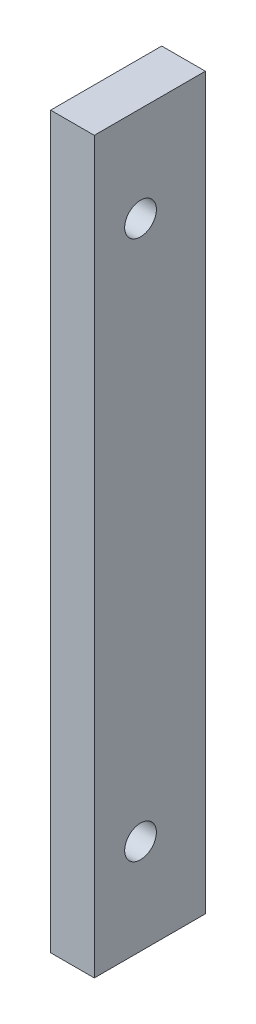
ISO-10303-21;
HEADER;
FILE_DESCRIPTION(('STEP AP214'),'2;1');
FILE_NAME('part.step','',(''),(''),'','','');
FILE_SCHEMA(('AUTOMOTIVE_DESIGN { 1 0 10303 214 1 1 1 1 }'));
ENDSEC;
DATA;
#1=APPLICATION_CONTEXT('core data for automotive mechanical design processes');
#2=APPLICATION_PROTOCOL_DEFINITION('international standard','automotive_design',2000,#1);
#3=PRODUCT_CONTEXT('',#1,'mechanical');
#4=PRODUCT('Part','Part','',(#3));
#5=PRODUCT_RELATED_PRODUCT_CATEGORY('part','',(#4));
#6=PRODUCT_DEFINITION_FORMATION('','',#4);
#7=PRODUCT_DEFINITION_CONTEXT('part definition',#1,'design');
#8=PRODUCT_DEFINITION('design','',#6,#7);
#9=PRODUCT_DEFINITION_SHAPE('','',#8);
#10=(LENGTH_UNIT() NAMED_UNIT(*) SI_UNIT(.MILLI.,.METRE.));
#11=(NAMED_UNIT(*) PLANE_ANGLE_UNIT() SI_UNIT($,.RADIAN.));
#12=(NAMED_UNIT(*) SI_UNIT($,.STERADIAN.) SOLID_ANGLE_UNIT());
#13=UNCERTAINTY_MEASURE_WITH_UNIT(LENGTH_MEASURE(1.E-05),#10,'distance_accuracy_value','');
#14=(GEOMETRIC_REPRESENTATION_CONTEXT(3) GLOBAL_UNCERTAINTY_ASSIGNED_CONTEXT((#13)) GLOBAL_UNIT_ASSIGNED_CONTEXT((#10,
#11,#12)) REPRESENTATION_CONTEXT('',''));
#15=CARTESIAN_POINT('',(0.,0.,0.));
#16=DIRECTION('',(0.,0.,1.));
#17=DIRECTION('',(1.,0.,0.));
#18=AXIS2_PLACEMENT_3D('',#15,#16,#17);
#19=CARTESIAN_POINT('',(0.,584.2,0.));
#20=DIRECTION('',(0.,0.,-1.));
#21=DIRECTION('',(-1.,0.,0.));
#22=AXIS2_PLACEMENT_3D('',#19,#20,#21);
#23=PLANE('',#22);
#24=DIRECTION('',(0.,-1.,0.));
#25=VECTOR('',#24,1.);
#26=CARTESIAN_POINT('',(34.925,0.,0.));
#27=LINE('',#26,#25);
#28=CARTESIAN_POINT('',(34.925,584.2,0.));
#29=VERTEX_POINT('',#28);
#30=CARTESIAN_POINT('',(34.925,0.,0.));
#31=VERTEX_POINT('',#30);
#32=EDGE_CURVE('E48',#29,#31,#27,.T.);
#33=ORIENTED_EDGE('',*,*,#32,.F.);
#34=DIRECTION('',(1.,0.,0.));
#35=VECTOR('',#34,1.);
#36=CARTESIAN_POINT('',(0.,584.2,0.));
#37=LINE('',#36,#35);
#38=CARTESIAN_POINT('',(0.,584.2,0.));
#39=VERTEX_POINT('',#38);
#40=EDGE_CURVE('E97',#39,#29,#37,.T.);
#41=ORIENTED_EDGE('',*,*,#40,.F.);
#42=DIRECTION('',(0.,-1.,0.));
#43=VECTOR('',#42,1.);
#44=CARTESIAN_POINT('',(0.,584.2,0.));
#45=LINE('',#44,#43);
#46=CARTESIAN_POINT('',(0.,0.,0.));
#47=VERTEX_POINT('',#46);
#48=EDGE_CURVE('E11',#39,#47,#45,.T.);
#49=ORIENTED_EDGE('',*,*,#48,.T.);
#50=DIRECTION('',(1.,0.,0.));
#51=VECTOR('',#50,1.);
#52=CARTESIAN_POINT('',(0.,0.,0.));
#53=LINE('',#52,#51);
#54=EDGE_CURVE('E81',#47,#31,#53,.T.);
#55=ORIENTED_EDGE('',*,*,#54,.T.);
#56=EDGE_LOOP('',(#33,#41,#49,#55));
#57=FACE_BOUND('',#56,.T.);
#58=ADVANCED_FACE('F33',(#57),#23,.F.);
#59=CARTESIAN_POINT('',(0.,584.2,-88.9));
#60=DIRECTION('',(0.,0.,1.));
#61=DIRECTION('',(1.,0.,0.));
#62=AXIS2_PLACEMENT_3D('',#59,#60,#61);
#63=PLANE('',#62);
#64=DIRECTION('',(0.,1.,0.));
#65=VECTOR('',#64,1.);
#66=CARTESIAN_POINT('',(34.925,0.,-88.9));
#67=LINE('',#66,#65);
#68=CARTESIAN_POINT('',(34.925,0.,-88.9));
#69=VERTEX_POINT('',#68);
#70=CARTESIAN_POINT('',(34.925,584.2,-88.9));
#71=VERTEX_POINT('',#70);
#72=EDGE_CURVE('E77',#69,#71,#67,.T.);
#73=ORIENTED_EDGE('',*,*,#72,.F.);
#74=DIRECTION('',(-1.,0.,0.));
#75=VECTOR('',#74,1.);
#76=CARTESIAN_POINT('',(0.,0.,-88.9));
#77=LINE('',#76,#75);
#78=CARTESIAN_POINT('',(0.,0.,-88.9));
#79=VERTEX_POINT('',#78);
#80=EDGE_CURVE('E71',#69,#79,#77,.T.);
#81=ORIENTED_EDGE('',*,*,#80,.T.);
#82=DIRECTION('',(0.,-1.,0.));
#83=VECTOR('',#82,1.);
#84=CARTESIAN_POINT('',(0.,584.2,-88.9));
#85=LINE('',#84,#83);
#86=CARTESIAN_POINT('',(0.,584.2,-88.9));
#87=VERTEX_POINT('',#86);
#88=EDGE_CURVE('E41',#87,#79,#85,.T.);
#89=ORIENTED_EDGE('',*,*,#88,.F.);
#90=DIRECTION('',(-1.,0.,0.));
#91=VECTOR('',#90,1.);
#92=CARTESIAN_POINT('',(0.,584.2,-88.9));
#93=LINE('',#92,#91);
#94=EDGE_CURVE('E57',#71,#87,#93,.T.);
#95=ORIENTED_EDGE('',*,*,#94,.F.);
#96=EDGE_LOOP('',(#73,#81,#89,#95));
#97=FACE_BOUND('',#96,.T.);
#98=ADVANCED_FACE('F73',(#97),#63,.F.);
#99=CARTESIAN_POINT('',(0.,584.2,0.));
#100=DIRECTION('',(0.,-1.,0.));
#101=DIRECTION('',(0.,0.,-1.));
#102=AXIS2_PLACEMENT_3D('',#99,#100,#101);
#103=PLANE('',#102);
#104=DIRECTION('',(0.,0.,1.));
#105=VECTOR('',#104,1.);
#106=CARTESIAN_POINT('',(34.925,584.2,0.));
#107=LINE('',#106,#105);
#108=EDGE_CURVE('E107',#71,#29,#107,.T.);
#109=ORIENTED_EDGE('',*,*,#108,.F.);
#110=ORIENTED_EDGE('',*,*,#94,.T.);
#111=DIRECTION('',(0.,0.,1.));
#112=VECTOR('',#111,1.);
#113=CARTESIAN_POINT('',(0.,584.2,0.));
#114=LINE('',#113,#112);
#115=EDGE_CURVE('E80',#87,#39,#114,.T.);
#116=ORIENTED_EDGE('',*,*,#115,.T.);
#117=ORIENTED_EDGE('',*,*,#40,.T.);
#118=EDGE_LOOP('',(#109,#110,#116,#117));
#119=FACE_BOUND('',#118,.T.);
#120=ADVANCED_FACE('F135',(#119),#103,.F.);
#121=CARTESIAN_POINT('',(0.,0.,0.));
#122=DIRECTION('',(0.,-1.,0.));
#123=DIRECTION('',(0.,0.,-1.));
#124=AXIS2_PLACEMENT_3D('',#121,#122,#123);
#125=PLANE('',#124);
#126=ORIENTED_EDGE('',*,*,#80,.F.);
#127=DIRECTION('',(0.,0.,-1.));
#128=VECTOR('',#127,1.);
#129=CARTESIAN_POINT('',(34.925,0.,0.));
#130=LINE('',#129,#128);
#131=EDGE_CURVE('E110',#31,#69,#130,.T.);
#132=ORIENTED_EDGE('',*,*,#131,.F.);
#133=ORIENTED_EDGE('',*,*,#54,.F.);
#134=DIRECTION('',(0.,0.,1.));
#135=VECTOR('',#134,1.);
#136=CARTESIAN_POINT('',(0.,0.,0.));
#137=LINE('',#136,#135);
#138=EDGE_CURVE('E86',#79,#47,#137,.T.);
#139=ORIENTED_EDGE('',*,*,#138,.F.);
#140=EDGE_LOOP('',(#126,#132,#133,#139));
#141=FACE_BOUND('',#140,.T.);
#142=ADVANCED_FACE('F87',(#141),#125,.T.);
#143=CARTESIAN_POINT('',(0.,76.2,-37.0103400000001));
#144=DIRECTION('',(1.,0.,0.));
#145=DIRECTION('',(0.,0.,-1.));
#146=AXIS2_PLACEMENT_3D('',#143,#144,#145);
#147=CYLINDRICAL_SURFACE('',#146,12.7);
#148=CARTESIAN_POINT('',(0.,76.2,-37.0103400000001));
#149=DIRECTION('',(1.,0.,0.));
#150=DIRECTION('',(0.,0.,-1.));
#151=AXIS2_PLACEMENT_3D('',#148,#149,#150);
#152=CIRCLE('',#151,12.7);
#153=CARTESIAN_POINT('',(0.,76.2,-49.7103400000001));
#154=VERTEX_POINT('',#153);
#155=EDGE_CURVE('E93',#154,#154,#152,.T.);
#156=CARTESIAN_POINT('',(34.925,76.2,-37.0103400000001));
#157=DIRECTION('',(1.,0.,0.));
#158=DIRECTION('',(0.,0.,-1.));
#159=AXIS2_PLACEMENT_3D('',#156,#157,#158);
#160=CIRCLE('',#159,12.7);
#161=CARTESIAN_POINT('',(34.925,76.2,-49.7103400000001));
#162=VERTEX_POINT('',#161);
#163=EDGE_CURVE('E102',#162,#162,#160,.F.);
#164=CARTESIAN_POINT('',(0.,76.2,-49.7103400000001));
#165=CARTESIAN_POINT('',(0.363802083333333,76.2,-49.7103400000001));
#166=CARTESIAN_POINT('',(0.727604166666667,76.2,-49.7103400000001));
#167=CARTESIAN_POINT('',(1.45520833333333,76.2,-49.7103400000001));
#168=CARTESIAN_POINT('',(1.81901041666667,76.2,-49.7103400000001));
#169=CARTESIAN_POINT('',(2.54661458333333,76.2,-49.7103400000001));
#170=CARTESIAN_POINT('',(2.91041666666667,76.2,-49.7103400000001));
#171=CARTESIAN_POINT('',(3.63802083333333,76.2,-49.7103400000001));
#172=CARTESIAN_POINT('',(4.00182291666667,76.2,-49.7103400000001));
#173=CARTESIAN_POINT('',(4.72942708333333,76.2,-49.7103400000001));
#174=CARTESIAN_POINT('',(5.09322916666667,76.2,-49.7103400000001));
#175=CARTESIAN_POINT('',(5.82083333333333,76.2,-49.7103400000001));
#176=CARTESIAN_POINT('',(6.18463541666667,76.2,-49.7103400000001));
#177=CARTESIAN_POINT('',(6.91223958333333,76.2,-49.7103400000001));
#178=CARTESIAN_POINT('',(7.27604166666667,76.2,-49.7103400000001));
#179=CARTESIAN_POINT('',(8.00364583333334,76.2,-49.7103400000001));
#180=CARTESIAN_POINT('',(8.36744791666667,76.2,-49.7103400000001));
#181=CARTESIAN_POINT('',(9.09505208333333,76.2,-49.7103400000001));
#182=CARTESIAN_POINT('',(9.45885416666667,76.2,-49.7103400000001));
#183=CARTESIAN_POINT('',(10.1864583333333,76.2,-49.7103400000001));
#184=CARTESIAN_POINT('',(10.5502604166667,76.2,-49.7103400000001));
#185=CARTESIAN_POINT('',(11.2778645833333,76.2,-49.7103400000001));
#186=CARTESIAN_POINT('',(11.6416666666667,76.2,-49.7103400000001));
#187=CARTESIAN_POINT('',(12.3692708333333,76.2,-49.7103400000001));
#188=CARTESIAN_POINT('',(12.7330729166667,76.2,-49.7103400000001));
#189=CARTESIAN_POINT('',(13.4606770833333,76.2,-49.7103400000001));
#190=CARTESIAN_POINT('',(13.8244791666667,76.2,-49.7103400000001));
#191=CARTESIAN_POINT('',(14.5520833333333,76.2,-49.7103400000001));
#192=CARTESIAN_POINT('',(14.9158854166667,76.2,-49.7103400000001));
#193=CARTESIAN_POINT('',(15.6434895833333,76.2,-49.7103400000001));
#194=CARTESIAN_POINT('',(16.0072916666667,76.2,-49.7103400000001));
#195=CARTESIAN_POINT('',(16.7348958333333,76.2,-49.7103400000001));
#196=CARTESIAN_POINT('',(17.0986979166667,76.2,-49.7103400000001));
#197=CARTESIAN_POINT('',(17.8263020833333,76.2,-49.7103400000001));
#198=CARTESIAN_POINT('',(18.1901041666667,76.2,-49.7103400000001));
#199=CARTESIAN_POINT('',(18.9177083333333,76.2,-49.7103400000001));
#200=CARTESIAN_POINT('',(19.2815104166667,76.2,-49.7103400000001));
#201=CARTESIAN_POINT('',(20.0091145833333,76.2,-49.7103400000001));
#202=CARTESIAN_POINT('',(20.3729166666667,76.2,-49.7103400000001));
#203=CARTESIAN_POINT('',(21.1005208333333,76.2,-49.7103400000001));
#204=CARTESIAN_POINT('',(21.4643229166667,76.2,-49.7103400000001));
#205=CARTESIAN_POINT('',(22.1919270833333,76.2,-49.7103400000001));
#206=CARTESIAN_POINT('',(22.5557291666667,76.2,-49.7103400000001));
#207=CARTESIAN_POINT('',(23.2833333333333,76.2,-49.7103400000001));
#208=CARTESIAN_POINT('',(23.6471354166667,76.2,-49.7103400000001));
#209=CARTESIAN_POINT('',(24.3747395833333,76.2,-49.7103400000001));
#210=CARTESIAN_POINT('',(24.7385416666667,76.2,-49.7103400000001));
#211=CARTESIAN_POINT('',(25.4661458333333,76.2,-49.7103400000001));
#212=CARTESIAN_POINT('',(25.8299479166667,76.2,-49.7103400000001));
#213=CARTESIAN_POINT('',(26.5575520833333,76.2,-49.7103400000001));
#214=CARTESIAN_POINT('',(26.9213541666667,76.2,-49.7103400000001));
#215=CARTESIAN_POINT('',(27.6489583333333,76.2,-49.7103400000001));
#216=CARTESIAN_POINT('',(28.0127604166667,76.2,-49.7103400000001));
#217=CARTESIAN_POINT('',(28.7403645833333,76.2,-49.7103400000001));
#218=CARTESIAN_POINT('',(29.1041666666667,76.2,-49.7103400000001));
#219=CARTESIAN_POINT('',(29.8317708333333,76.2,-49.7103400000001));
#220=CARTESIAN_POINT('',(30.1955729166667,76.2,-49.7103400000001));
#221=CARTESIAN_POINT('',(30.9231770833333,76.2,-49.7103400000001));
#222=CARTESIAN_POINT('',(31.2869791666667,76.2,-49.7103400000001));
#223=CARTESIAN_POINT('',(32.0145833333333,76.2,-49.7103400000001));
#224=CARTESIAN_POINT('',(32.3783854166667,76.2,-49.7103400000001));
#225=CARTESIAN_POINT('',(33.1059895833333,76.2,-49.7103400000001));
#226=CARTESIAN_POINT('',(33.4697916666667,76.2,-49.7103400000001));
#227=CARTESIAN_POINT('',(34.1973958333333,76.2,-49.7103400000001));
#228=CARTESIAN_POINT('',(34.5611979166667,76.2,-49.7103400000001));
#229=CARTESIAN_POINT('',(34.925,76.2,-49.7103400000001));
#230=B_SPLINE_CURVE_WITH_KNOTS('',3,(#164,#165,#166,#167,#168,#169,#170,#171,#172,#173,#174,
#175,#176,#177,#178,#179,#180,#181,#182,#183,#184,#185,#186,#187,#188,#189,#190,#191,#192,#193,
#194,#195,#196,#197,#198,#199,#200,#201,#202,#203,#204,#205,#206,#207,#208,#209,#210,#211,#212,
#213,#214,#215,#216,#217,#218,#219,#220,#221,#222,#223,#224,#225,#226,#227,#228,#229),
.UNSPECIFIED.,.F.,.F.,(4,2,2,2,2,2,2,2,2,2,2,2,2,2,2,2,2,2,2,2,2,2,2,2,2,2,2,2,2,2,2,2,4),(0.,
1.09140625,2.1828125,3.27421875,4.365625,5.45703125,6.5484375,7.63984375,8.73125,9.82265625,
10.9140625,12.00546875,13.096875,14.18828125,15.2796875,16.37109375,17.4625,18.55390625,
19.6453125,20.73671875,21.828125,22.91953125,24.0109375,25.10234375,26.19375,27.28515625,
28.3765625,29.46796875,30.559375,31.65078125,32.7421875,33.83359375,34.925),.UNSPECIFIED.);
#231=EDGE_CURVE('BSEAM124',#154,#162,#230,.T.);
#232=ORIENTED_EDGE('',*,*,#155,.F.);
#233=ORIENTED_EDGE('',*,*,#163,.F.);
#234=ORIENTED_EDGE('',*,*,#231,.T.);
#235=ORIENTED_EDGE('',*,*,#231,.F.);
#236=EDGE_LOOP('',(#232,#234,#233,#235));
#237=FACE_BOUND('',#236,.T.);
#238=ADVANCED_FACE('F124',(#237),#147,.F.);
#239=CARTESIAN_POINT('',(0.,508.,-37.01034));
#240=DIRECTION('',(1.,0.,0.));
#241=DIRECTION('',(0.,0.,-1.));
#242=AXIS2_PLACEMENT_3D('',#239,#240,#241);
#243=CYLINDRICAL_SURFACE('',#242,12.7);
#244=CARTESIAN_POINT('',(0.,508.,-37.01034));
#245=DIRECTION('',(1.,0.,0.));
#246=DIRECTION('',(0.,0.,-1.));
#247=AXIS2_PLACEMENT_3D('',#244,#245,#246);
#248=CIRCLE('',#247,12.7);
#249=CARTESIAN_POINT('',(0.,508.,-49.71034));
#250=VERTEX_POINT('',#249);
#251=EDGE_CURVE('E89',#250,#250,#248,.T.);
#252=CARTESIAN_POINT('',(34.925,508.,-37.01034));
#253=DIRECTION('',(1.,0.,0.));
#254=DIRECTION('',(0.,0.,-1.));
#255=AXIS2_PLACEMENT_3D('',#252,#253,#254);
#256=CIRCLE('',#255,12.7);
#257=CARTESIAN_POINT('',(34.925,508.,-49.71034));
#258=VERTEX_POINT('',#257);
#259=EDGE_CURVE('E112',#258,#258,#256,.T.);
#260=CARTESIAN_POINT('',(0.,508.,-49.71034));
#261=CARTESIAN_POINT('',(0.363802083333333,508.,-49.71034));
#262=CARTESIAN_POINT('',(0.727604166666667,508.,-49.71034));
#263=CARTESIAN_POINT('',(1.45520833333333,508.,-49.71034));
#264=CARTESIAN_POINT('',(1.81901041666667,508.,-49.71034));
#265=CARTESIAN_POINT('',(2.54661458333333,508.,-49.71034));
#266=CARTESIAN_POINT('',(2.91041666666667,508.,-49.71034));
#267=CARTESIAN_POINT('',(3.63802083333333,508.,-49.71034));
#268=CARTESIAN_POINT('',(4.00182291666667,508.,-49.71034));
#269=CARTESIAN_POINT('',(4.72942708333333,508.,-49.71034));
#270=CARTESIAN_POINT('',(5.09322916666667,508.,-49.71034));
#271=CARTESIAN_POINT('',(5.82083333333333,508.,-49.71034));
#272=CARTESIAN_POINT('',(6.18463541666667,508.,-49.71034));
#273=CARTESIAN_POINT('',(6.91223958333333,508.,-49.71034));
#274=CARTESIAN_POINT('',(7.27604166666667,508.,-49.71034));
#275=CARTESIAN_POINT('',(8.00364583333334,508.,-49.71034));
#276=CARTESIAN_POINT('',(8.36744791666667,508.,-49.71034));
#277=CARTESIAN_POINT('',(9.09505208333333,508.,-49.71034));
#278=CARTESIAN_POINT('',(9.45885416666667,508.,-49.71034));
#279=CARTESIAN_POINT('',(10.1864583333333,508.,-49.71034));
#280=CARTESIAN_POINT('',(10.5502604166667,508.,-49.71034));
#281=CARTESIAN_POINT('',(11.2778645833333,508.,-49.71034));
#282=CARTESIAN_POINT('',(11.6416666666667,508.,-49.71034));
#283=CARTESIAN_POINT('',(12.3692708333333,508.,-49.71034));
#284=CARTESIAN_POINT('',(12.7330729166667,508.,-49.71034));
#285=CARTESIAN_POINT('',(13.4606770833333,508.,-49.71034));
#286=CARTESIAN_POINT('',(13.8244791666667,508.,-49.71034));
#287=CARTESIAN_POINT('',(14.5520833333333,508.,-49.71034));
#288=CARTESIAN_POINT('',(14.9158854166667,508.,-49.71034));
#289=CARTESIAN_POINT('',(15.6434895833333,508.,-49.71034));
#290=CARTESIAN_POINT('',(16.0072916666667,508.,-49.71034));
#291=CARTESIAN_POINT('',(16.7348958333333,508.,-49.71034));
#292=CARTESIAN_POINT('',(17.0986979166667,508.,-49.71034));
#293=CARTESIAN_POINT('',(17.8263020833333,508.,-49.71034));
#294=CARTESIAN_POINT('',(18.1901041666667,508.,-49.71034));
#295=CARTESIAN_POINT('',(18.9177083333333,508.,-49.71034));
#296=CARTESIAN_POINT('',(19.2815104166667,508.,-49.71034));
#297=CARTESIAN_POINT('',(20.0091145833333,508.,-49.71034));
#298=CARTESIAN_POINT('',(20.3729166666667,508.,-49.71034));
#299=CARTESIAN_POINT('',(21.1005208333333,508.,-49.71034));
#300=CARTESIAN_POINT('',(21.4643229166667,508.,-49.71034));
#301=CARTESIAN_POINT('',(22.1919270833333,508.,-49.71034));
#302=CARTESIAN_POINT('',(22.5557291666667,508.,-49.71034));
#303=CARTESIAN_POINT('',(23.2833333333333,508.,-49.71034));
#304=CARTESIAN_POINT('',(23.6471354166667,508.,-49.71034));
#305=CARTESIAN_POINT('',(24.3747395833333,508.,-49.71034));
#306=CARTESIAN_POINT('',(24.7385416666667,508.,-49.71034));
#307=CARTESIAN_POINT('',(25.4661458333333,508.,-49.71034));
#308=CARTESIAN_POINT('',(25.8299479166667,508.,-49.71034));
#309=CARTESIAN_POINT('',(26.5575520833333,508.,-49.71034));
#310=CARTESIAN_POINT('',(26.9213541666667,508.,-49.71034));
#311=CARTESIAN_POINT('',(27.6489583333333,508.,-49.71034));
#312=CARTESIAN_POINT('',(28.0127604166667,508.,-49.71034));
#313=CARTESIAN_POINT('',(28.7403645833333,508.,-49.71034));
#314=CARTESIAN_POINT('',(29.1041666666667,508.,-49.71034));
#315=CARTESIAN_POINT('',(29.8317708333333,508.,-49.71034));
#316=CARTESIAN_POINT('',(30.1955729166667,508.,-49.71034));
#317=CARTESIAN_POINT('',(30.9231770833333,508.,-49.71034));
#318=CARTESIAN_POINT('',(31.2869791666667,508.,-49.71034));
#319=CARTESIAN_POINT('',(32.0145833333333,508.,-49.71034));
#320=CARTESIAN_POINT('',(32.3783854166667,508.,-49.71034));
#321=CARTESIAN_POINT('',(33.1059895833333,508.,-49.71034));
#322=CARTESIAN_POINT('',(33.4697916666667,508.,-49.71034));
#323=CARTESIAN_POINT('',(34.1973958333333,508.,-49.71034));
#324=CARTESIAN_POINT('',(34.5611979166667,508.,-49.71034));
#325=CARTESIAN_POINT('',(34.925,508.,-49.71034));
#326=B_SPLINE_CURVE_WITH_KNOTS('',3,(#260,#261,#262,#263,#264,#265,#266,#267,#268,#269,#270,
#271,#272,#273,#274,#275,#276,#277,#278,#279,#280,#281,#282,#283,#284,#285,#286,#287,#288,#289,
#290,#291,#292,#293,#294,#295,#296,#297,#298,#299,#300,#301,#302,#303,#304,#305,#306,#307,#308,
#309,#310,#311,#312,#313,#314,#315,#316,#317,#318,#319,#320,#321,#322,#323,#324,#325),
.UNSPECIFIED.,.F.,.F.,(4,2,2,2,2,2,2,2,2,2,2,2,2,2,2,2,2,2,2,2,2,2,2,2,2,2,2,2,2,2,2,2,4),(0.,
1.09140625,2.1828125,3.27421875,4.365625,5.45703125,6.5484375,7.63984375,8.73125,9.82265625,
10.9140625,12.00546875,13.096875,14.18828125,15.2796875,16.37109375,17.4625,18.55390625,
19.6453125,20.73671875,21.828125,22.91953125,24.0109375,25.10234375,26.19375,27.28515625,
28.3765625,29.46796875,30.559375,31.65078125,32.7421875,33.83359375,34.925),.UNSPECIFIED.);
#327=EDGE_CURVE('BSEAM116',#250,#258,#326,.T.);
#328=ORIENTED_EDGE('',*,*,#251,.F.);
#329=ORIENTED_EDGE('',*,*,#259,.T.);
#330=ORIENTED_EDGE('',*,*,#327,.T.);
#331=ORIENTED_EDGE('',*,*,#327,.F.);
#332=EDGE_LOOP('',(#328,#330,#329,#331));
#333=FACE_BOUND('',#332,.T.);
#334=ADVANCED_FACE('F116',(#333),#243,.F.);
#335=CARTESIAN_POINT('',(0.,584.2,0.));
#336=DIRECTION('',(1.,0.,0.));
#337=DIRECTION('',(0.,0.,-1.));
#338=AXIS2_PLACEMENT_3D('',#335,#336,#337);
#339=PLANE('',#338);
#340=ORIENTED_EDGE('',*,*,#251,.T.);
#341=EDGE_LOOP('',(#340));
#342=FACE_BOUND('',#341,.T.);
#343=ORIENTED_EDGE('',*,*,#155,.T.);
#344=EDGE_LOOP('',(#343));
#345=FACE_BOUND('',#344,.T.);
#346=ORIENTED_EDGE('',*,*,#138,.T.);
#347=ORIENTED_EDGE('',*,*,#48,.F.);
#348=ORIENTED_EDGE('',*,*,#115,.F.);
#349=ORIENTED_EDGE('',*,*,#88,.T.);
#350=EDGE_LOOP('',(#346,#347,#348,#349));
#351=FACE_BOUND('',#350,.T.);
#352=ADVANCED_FACE('F35',(#342,#345,#351),#339,.F.);
#353=CARTESIAN_POINT('',(34.925,0.,0.));
#354=DIRECTION('',(1.,0.,0.));
#355=DIRECTION('',(0.,0.,-1.));
#356=AXIS2_PLACEMENT_3D('',#353,#354,#355);
#357=PLANE('',#356);
#358=ORIENTED_EDGE('',*,*,#259,.F.);
#359=EDGE_LOOP('',(#358));
#360=FACE_BOUND('',#359,.T.);
#361=ORIENTED_EDGE('',*,*,#131,.T.);
#362=ORIENTED_EDGE('',*,*,#72,.T.);
#363=ORIENTED_EDGE('',*,*,#108,.T.);
#364=ORIENTED_EDGE('',*,*,#32,.T.);
#365=EDGE_LOOP('',(#361,#362,#363,#364));
#366=FACE_BOUND('',#365,.T.);
#367=ORIENTED_EDGE('',*,*,#163,.T.);
#368=EDGE_LOOP('',(#367));
#369=FACE_BOUND('',#368,.T.);
#370=ADVANCED_FACE('F118',(#360,#366,#369),#357,.T.);
#371=CLOSED_SHELL('',(#58,#98,#120,#142,#238,#334,#352,#370));
#372=MANIFOLD_SOLID_BREP('B2',#371);
#373=ADVANCED_BREP_SHAPE_REPRESENTATION('',(#18,#372),#14);
#374=SHAPE_DEFINITION_REPRESENTATION(#9,#373);
ENDSEC;
END-ISO-10303-21;
